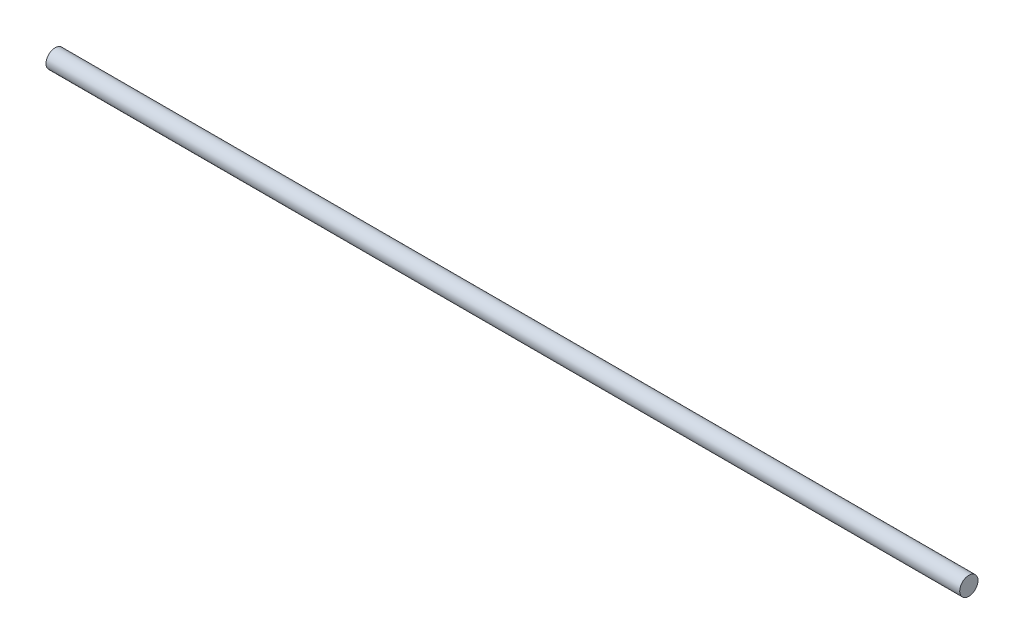
ISO-10303-21;
HEADER;
FILE_DESCRIPTION(('STEP AP214'),'2;1');
FILE_NAME('part.step','',(''),(''),'','','');
FILE_SCHEMA(('AUTOMOTIVE_DESIGN { 1 0 10303 214 1 1 1 1 }'));
ENDSEC;
DATA;
#1=APPLICATION_CONTEXT('core data for automotive mechanical design processes');
#2=APPLICATION_PROTOCOL_DEFINITION('international standard','automotive_design',2000,#1);
#3=PRODUCT_CONTEXT('',#1,'mechanical');
#4=PRODUCT('Part','Part','',(#3));
#5=PRODUCT_RELATED_PRODUCT_CATEGORY('part','',(#4));
#6=PRODUCT_DEFINITION_FORMATION('','',#4);
#7=PRODUCT_DEFINITION_CONTEXT('part definition',#1,'design');
#8=PRODUCT_DEFINITION('design','',#6,#7);
#9=PRODUCT_DEFINITION_SHAPE('','',#8);
#10=(LENGTH_UNIT() NAMED_UNIT(*) SI_UNIT(.MILLI.,.METRE.));
#11=(NAMED_UNIT(*) PLANE_ANGLE_UNIT() SI_UNIT($,.RADIAN.));
#12=(NAMED_UNIT(*) SI_UNIT($,.STERADIAN.) SOLID_ANGLE_UNIT());
#13=UNCERTAINTY_MEASURE_WITH_UNIT(LENGTH_MEASURE(1.E-05),#10,'distance_accuracy_value','');
#14=(GEOMETRIC_REPRESENTATION_CONTEXT(3) GLOBAL_UNCERTAINTY_ASSIGNED_CONTEXT((#13)) GLOBAL_UNIT_ASSIGNED_CONTEXT((#10,
#11,#12)) REPRESENTATION_CONTEXT('',''));
#15=CARTESIAN_POINT('',(0.,0.,0.));
#16=DIRECTION('',(0.,0.,1.));
#17=DIRECTION('',(1.,0.,0.));
#18=AXIS2_PLACEMENT_3D('',#15,#16,#17);
#19=CARTESIAN_POINT('',(50.,0.,0.));
#20=DIRECTION('',(-1.,0.,0.));
#21=DIRECTION('',(0.,0.,1.));
#22=AXIS2_PLACEMENT_3D('',#19,#20,#21);
#23=CYLINDRICAL_SURFACE('',#22,1.);
#24=CARTESIAN_POINT('',(50.,0.,0.));
#25=DIRECTION('',(1.,0.,0.));
#26=DIRECTION('',(0.,0.,-1.));
#27=AXIS2_PLACEMENT_3D('',#24,#25,#26);
#28=CIRCLE('',#27,1.);
#29=CARTESIAN_POINT('',(50.,0.,-1.));
#30=VERTEX_POINT('',#29);
#31=EDGE_CURVE('E10',#30,#30,#28,.T.);
#32=ORIENTED_EDGE('',*,*,#31,.F.);
#33=EDGE_LOOP('',(#32));
#34=FACE_BOUND('',#33,.T.);
#35=CARTESIAN_POINT('',(-50.,0.,0.));
#36=DIRECTION('',(1.,0.,0.));
#37=DIRECTION('',(0.,0.,-1.));
#38=AXIS2_PLACEMENT_3D('',#35,#36,#37);
#39=CIRCLE('',#38,1.);
#40=CARTESIAN_POINT('',(-50.,0.,-1.));
#41=VERTEX_POINT('',#40);
#42=EDGE_CURVE('E37',#41,#41,#39,.T.);
#43=ORIENTED_EDGE('',*,*,#42,.T.);
#44=EDGE_LOOP('',(#43));
#45=FACE_BOUND('',#44,.T.);
#46=ADVANCED_FACE('F40',(#34,#45),#23,.T.);
#47=CARTESIAN_POINT('',(50.,0.,0.));
#48=DIRECTION('',(1.,0.,0.));
#49=DIRECTION('',(0.,0.,-1.));
#50=AXIS2_PLACEMENT_3D('',#47,#48,#49);
#51=PLANE('',#50);
#52=ORIENTED_EDGE('',*,*,#31,.T.);
#53=EDGE_LOOP('',(#52));
#54=FACE_BOUND('',#53,.T.);
#55=ADVANCED_FACE('F55',(#54),#51,.T.);
#56=CARTESIAN_POINT('',(-50.,0.,0.));
#57=DIRECTION('',(1.,0.,0.));
#58=DIRECTION('',(0.,0.,-1.));
#59=AXIS2_PLACEMENT_3D('',#56,#57,#58);
#60=PLANE('',#59);
#61=ORIENTED_EDGE('',*,*,#42,.F.);
#62=EDGE_LOOP('',(#61));
#63=FACE_BOUND('',#62,.T.);
#64=ADVANCED_FACE('F49',(#63),#60,.F.);
#65=CLOSED_SHELL('',(#46,#55,#64));
#66=MANIFOLD_SOLID_BREP('B2',#65);
#67=ADVANCED_BREP_SHAPE_REPRESENTATION('',(#18,#66),#14);
#68=SHAPE_DEFINITION_REPRESENTATION(#9,#67);
ENDSEC;
END-ISO-10303-21;
